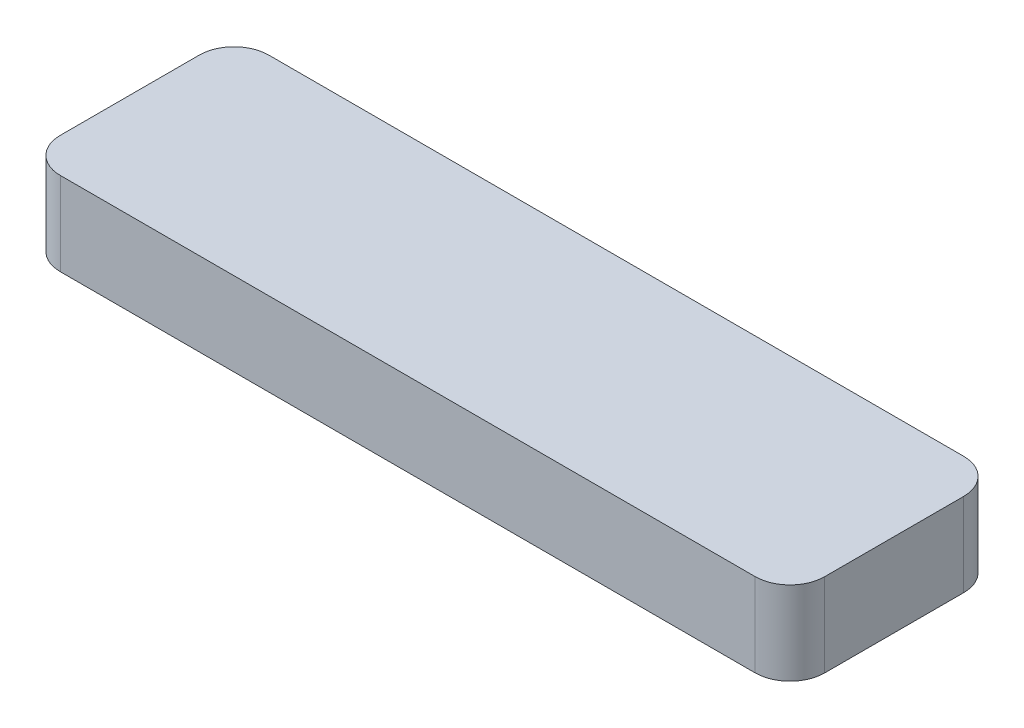
ISO-10303-21;
HEADER;
FILE_DESCRIPTION(('STEP AP214'),'2;1');
FILE_NAME('part.step','',(''),(''),'','','');
FILE_SCHEMA(('AUTOMOTIVE_DESIGN { 1 0 10303 214 1 1 1 1 }'));
ENDSEC;
DATA;
#1=APPLICATION_CONTEXT('core data for automotive mechanical design processes');
#2=APPLICATION_PROTOCOL_DEFINITION('international standard','automotive_design',2000,#1);
#3=PRODUCT_CONTEXT('',#1,'mechanical');
#4=PRODUCT('Part','Part','',(#3));
#5=PRODUCT_RELATED_PRODUCT_CATEGORY('part','',(#4));
#6=PRODUCT_DEFINITION_FORMATION('','',#4);
#7=PRODUCT_DEFINITION_CONTEXT('part definition',#1,'design');
#8=PRODUCT_DEFINITION('design','',#6,#7);
#9=PRODUCT_DEFINITION_SHAPE('','',#8);
#10=(LENGTH_UNIT() NAMED_UNIT(*) SI_UNIT(.MILLI.,.METRE.));
#11=(NAMED_UNIT(*) PLANE_ANGLE_UNIT() SI_UNIT($,.RADIAN.));
#12=(NAMED_UNIT(*) SI_UNIT($,.STERADIAN.) SOLID_ANGLE_UNIT());
#13=UNCERTAINTY_MEASURE_WITH_UNIT(LENGTH_MEASURE(1.E-05),#10,'distance_accuracy_value','');
#14=(GEOMETRIC_REPRESENTATION_CONTEXT(3) GLOBAL_UNCERTAINTY_ASSIGNED_CONTEXT((#13)) GLOBAL_UNIT_ASSIGNED_CONTEXT((#10,
#11,#12)) REPRESENTATION_CONTEXT('',''));
#15=CARTESIAN_POINT('',(0.,0.,0.));
#16=DIRECTION('',(0.,0.,1.));
#17=DIRECTION('',(1.,0.,0.));
#18=AXIS2_PLACEMENT_3D('',#15,#16,#17);
#19=CARTESIAN_POINT('',(40.1645862539652,-7.,-0.638374529553416));
#20=DIRECTION('',(1.,0.,0.));
#21=DIRECTION('',(0.,0.,-1.));
#22=AXIS2_PLACEMENT_3D('',#19,#20,#21);
#23=PLANE('',#22);
#24=DIRECTION('',(0.,1.,0.));
#25=VECTOR('',#24,1.);
#26=CARTESIAN_POINT('',(40.1645862539652,-9.,-7.10322873578327));
#27=LINE('',#26,#25);
#28=CARTESIAN_POINT('',(40.1645862539652,-4.,-7.10322873578327));
#29=VERTEX_POINT('',#28);
#30=CARTESIAN_POINT('',(40.1645862539652,-7.,-7.10322873578327));
#31=VERTEX_POINT('',#30);
#32=EDGE_CURVE('E209',#29,#31,#27,.F.);
#33=ORIENTED_EDGE('',*,*,#32,.F.);
#34=DIRECTION('',(0.,0.,-1.));
#35=VECTOR('',#34,1.);
#36=CARTESIAN_POINT('',(40.1645862539652,-4.,-0.638374529553416));
#37=LINE('',#36,#35);
#38=CARTESIAN_POINT('',(40.1645862539652,-4.,-7.43837452955341));
#39=VERTEX_POINT('',#38);
#40=EDGE_CURVE('E344',#29,#39,#37,.T.);
#41=ORIENTED_EDGE('',*,*,#40,.T.);
#42=DIRECTION('',(0.,1.,0.));
#43=VECTOR('',#42,1.);
#44=CARTESIAN_POINT('',(40.1645862539652,-7.,-7.43837452955341));
#45=LINE('',#44,#43);
#46=CARTESIAN_POINT('',(40.1645862539652,-7.,-7.43837452955341));
#47=VERTEX_POINT('',#46);
#48=EDGE_CURVE('E194',#47,#39,#45,.T.);
#49=ORIENTED_EDGE('',*,*,#48,.F.);
#50=DIRECTION('',(0.,0.,-1.));
#51=VECTOR('',#50,1.);
#52=CARTESIAN_POINT('',(40.1645862539652,-7.,-0.638374529553416));
#53=LINE('',#52,#51);
#54=EDGE_CURVE('E262',#31,#47,#53,.T.);
#55=ORIENTED_EDGE('',*,*,#54,.F.);
#56=EDGE_LOOP('',(#33,#41,#49,#55));
#57=FACE_BOUND('',#56,.T.);
#58=ADVANCED_FACE('F49',(#57),#23,.F.);
#59=DIRECTION('',(0.,1.,0.));
#60=VECTOR('',#59,1.);
#61=CARTESIAN_POINT('',(40.1645862539652,-7.,0.361625470446584));
#62=LINE('',#61,#60);
#63=CARTESIAN_POINT('',(40.1645862539652,-7.,0.361625470446584));
#64=VERTEX_POINT('',#63);
#65=CARTESIAN_POINT('',(40.1645862539652,-4.,0.361625470446584));
#66=VERTEX_POINT('',#65);
#67=EDGE_CURVE('E254',#64,#66,#62,.T.);
#68=ORIENTED_EDGE('',*,*,#67,.T.);
#69=DIRECTION('',(0.,0.,-1.));
#70=VECTOR('',#69,1.);
#71=CARTESIAN_POINT('',(40.1645862539652,-4.,-0.638374529553416));
#72=LINE('',#71,#70);
#73=CARTESIAN_POINT('',(40.1645862539652,-4.,0.0279345006787635));
#74=VERTEX_POINT('',#73);
#75=EDGE_CURVE('E295',#66,#74,#72,.T.);
#76=ORIENTED_EDGE('',*,*,#75,.T.);
#77=DIRECTION('',(0.,1.,0.));
#78=VECTOR('',#77,1.);
#79=CARTESIAN_POINT('',(40.1645862539652,-9.,0.0279345006787635));
#80=LINE('',#79,#78);
#81=CARTESIAN_POINT('',(40.1645862539652,-7.,0.0279345006787635));
#82=VERTEX_POINT('',#81);
#83=EDGE_CURVE('E213',#82,#74,#80,.T.);
#84=ORIENTED_EDGE('',*,*,#83,.F.);
#85=EDGE_CURVE('E265',#64,#82,#53,.T.);
#86=ORIENTED_EDGE('',*,*,#85,.F.);
#87=EDGE_LOOP('',(#68,#76,#84,#86));
#88=FACE_BOUND('',#87,.T.);
#89=ADVANCED_FACE('F293',(#88),#23,.F.);
#90=CARTESIAN_POINT('',(41.1645862539652,-7.,-7.43837452955341));
#91=DIRECTION('',(0.,0.,1.));
#92=DIRECTION('',(1.,0.,0.));
#93=AXIS2_PLACEMENT_3D('',#90,#91,#92);
#94=PLANE('',#93);
#95=DIRECTION('',(0.,1.,0.));
#96=VECTOR('',#95,1.);
#97=CARTESIAN_POINT('',(45.1536084731312,-9.,-7.43837452955341));
#98=LINE('',#97,#96);
#99=CARTESIAN_POINT('',(45.1536084731312,-4.,-7.43837452955341));
#100=VERTEX_POINT('',#99);
#101=CARTESIAN_POINT('',(45.1536084731312,-7.,-7.43837452955341));
#102=VERTEX_POINT('',#101);
#103=EDGE_CURVE('E304',#100,#102,#98,.F.);
#104=ORIENTED_EDGE('',*,*,#103,.F.);
#105=DIRECTION('',(1.,0.,0.));
#106=VECTOR('',#105,1.);
#107=CARTESIAN_POINT('',(41.1645862539652,-4.,-7.43837452955341));
#108=LINE('',#107,#106);
#109=CARTESIAN_POINT('',(45.5645862539652,-4.,-7.43837452955341));
#110=VERTEX_POINT('',#109);
#111=EDGE_CURVE('E65',#100,#110,#108,.T.);
#112=ORIENTED_EDGE('',*,*,#111,.T.);
#113=DIRECTION('',(0.,1.,0.));
#114=VECTOR('',#113,1.);
#115=CARTESIAN_POINT('',(45.5645862539652,-7.,-7.43837452955341));
#116=LINE('',#115,#114);
#117=CARTESIAN_POINT('',(45.5645862539652,-7.,-7.43837452955341));
#118=VERTEX_POINT('',#117);
#119=EDGE_CURVE('E253',#118,#110,#116,.T.);
#120=ORIENTED_EDGE('',*,*,#119,.F.);
#121=DIRECTION('',(1.,0.,0.));
#122=VECTOR('',#121,1.);
#123=CARTESIAN_POINT('',(41.1645862539652,-7.,-7.43837452955341));
#124=LINE('',#123,#122);
#125=EDGE_CURVE('E268',#102,#118,#124,.T.);
#126=ORIENTED_EDGE('',*,*,#125,.F.);
#127=EDGE_LOOP('',(#104,#112,#120,#126));
#128=FACE_BOUND('',#127,.T.);
#129=ADVANCED_FACE('F399',(#128),#94,.F.);
#130=ORIENTED_EDGE('',*,*,#48,.T.);
#131=DIRECTION('',(1.,0.,0.));
#132=VECTOR('',#131,1.);
#133=CARTESIAN_POINT('',(41.1645862539652,-4.,-7.43837452955341));
#134=LINE('',#133,#132);
#135=CARTESIAN_POINT('',(40.6661478739671,-4.,-7.43837452955341));
#136=VERTEX_POINT('',#135);
#137=EDGE_CURVE('E189',#39,#136,#134,.T.);
#138=ORIENTED_EDGE('',*,*,#137,.T.);
#139=DIRECTION('',(0.,1.,0.));
#140=VECTOR('',#139,1.);
#141=CARTESIAN_POINT('',(40.6661478739671,-9.,-7.43837452955341));
#142=LINE('',#141,#140);
#143=CARTESIAN_POINT('',(40.6661478739671,-7.,-7.43837452955341));
#144=VERTEX_POINT('',#143);
#145=EDGE_CURVE('E199',#144,#136,#142,.T.);
#146=ORIENTED_EDGE('',*,*,#145,.F.);
#147=EDGE_CURVE('E270',#47,#144,#124,.T.);
#148=ORIENTED_EDGE('',*,*,#147,.F.);
#149=EDGE_LOOP('',(#130,#138,#146,#148));
#150=FACE_BOUND('',#149,.T.);
#151=ADVANCED_FACE('F197',(#150),#94,.F.);
#152=CARTESIAN_POINT('',(45.5645862539652,-7.,-0.638374529553415));
#153=DIRECTION('',(-1.,0.,0.));
#154=DIRECTION('',(0.,0.,1.));
#155=AXIS2_PLACEMENT_3D('',#152,#153,#154);
#156=PLANE('',#155);
#157=DIRECTION('',(0.,1.,0.));
#158=VECTOR('',#157,1.);
#159=CARTESIAN_POINT('',(45.5645862539652,-9.,0.095880783506694));
#160=LINE('',#159,#158);
#161=CARTESIAN_POINT('',(45.5645862539652,-4.,0.095880783506694));
#162=VERTEX_POINT('',#161);
#163=CARTESIAN_POINT('',(45.5645862539652,-7.,0.095880783506694));
#164=VERTEX_POINT('',#163);
#165=EDGE_CURVE('E297',#162,#164,#160,.F.);
#166=ORIENTED_EDGE('',*,*,#165,.F.);
#167=DIRECTION('',(0.,0.,1.));
#168=VECTOR('',#167,1.);
#169=CARTESIAN_POINT('',(45.5645862539652,-4.,-0.638374529553415));
#170=LINE('',#169,#168);
#171=CARTESIAN_POINT('',(45.5645862539652,-4.,0.361625470446585));
#172=VERTEX_POINT('',#171);
#173=EDGE_CURVE('E336',#162,#172,#170,.T.);
#174=ORIENTED_EDGE('',*,*,#173,.T.);
#175=DIRECTION('',(0.,1.,0.));
#176=VECTOR('',#175,1.);
#177=CARTESIAN_POINT('',(45.5645862539652,-7.,0.361625470446585));
#178=LINE('',#177,#176);
#179=CARTESIAN_POINT('',(45.5645862539652,-7.,0.361625470446585));
#180=VERTEX_POINT('',#179);
#181=EDGE_CURVE('E257',#180,#172,#178,.T.);
#182=ORIENTED_EDGE('',*,*,#181,.F.);
#183=DIRECTION('',(0.,0.,1.));
#184=VECTOR('',#183,1.);
#185=CARTESIAN_POINT('',(45.5645862539652,-7.,-0.638374529553415));
#186=LINE('',#185,#184);
#187=EDGE_CURVE('E272',#164,#180,#186,.T.);
#188=ORIENTED_EDGE('',*,*,#187,.F.);
#189=EDGE_LOOP('',(#166,#174,#182,#188));
#190=FACE_BOUND('',#189,.T.);
#191=ADVANCED_FACE('F390',(#190),#156,.F.);
#192=ORIENTED_EDGE('',*,*,#119,.T.);
#193=DIRECTION('',(0.,0.,1.));
#194=VECTOR('',#193,1.);
#195=CARTESIAN_POINT('',(45.5645862539652,-4.,-0.638374529553415));
#196=LINE('',#195,#194);
#197=CARTESIAN_POINT('',(45.5645862539652,-4.,-7.1711750186112));
#198=VERTEX_POINT('',#197);
#199=EDGE_CURVE('E341',#110,#198,#196,.T.);
#200=ORIENTED_EDGE('',*,*,#199,.T.);
#201=DIRECTION('',(0.,1.,0.));
#202=VECTOR('',#201,1.);
#203=CARTESIAN_POINT('',(45.5645862539652,-9.,-7.1711750186112));
#204=LINE('',#203,#202);
#205=CARTESIAN_POINT('',(45.5645862539652,-7.,-7.1711750186112));
#206=VERTEX_POINT('',#205);
#207=EDGE_CURVE('E306',#206,#198,#204,.T.);
#208=ORIENTED_EDGE('',*,*,#207,.F.);
#209=EDGE_CURVE('E273',#118,#206,#186,.T.);
#210=ORIENTED_EDGE('',*,*,#209,.F.);
#211=EDGE_LOOP('',(#192,#200,#208,#210));
#212=FACE_BOUND('',#211,.T.);
#213=ADVANCED_FACE('F394',(#212),#156,.F.);
#214=CARTESIAN_POINT('',(41.1645862539652,-7.,0.361625470446584));
#215=DIRECTION('',(0.,0.,-1.));
#216=DIRECTION('',(-1.,0.,0.));
#217=AXIS2_PLACEMENT_3D('',#214,#215,#216);
#218=PLANE('',#217);
#219=DIRECTION('',(0.,1.,0.));
#220=VECTOR('',#219,1.);
#221=CARTESIAN_POINT('',(40.6636205559815,-9.,0.361625470446584));
#222=LINE('',#221,#220);
#223=CARTESIAN_POINT('',(40.6636205559815,-4.,0.361625470446584));
#224=VERTEX_POINT('',#223);
#225=CARTESIAN_POINT('',(40.6636205559815,-7.,0.361625470446584));
#226=VERTEX_POINT('',#225);
#227=EDGE_CURVE('E73',#224,#226,#222,.F.);
#228=ORIENTED_EDGE('',*,*,#227,.F.);
#229=DIRECTION('',(-1.,0.,0.));
#230=VECTOR('',#229,1.);
#231=CARTESIAN_POINT('',(41.1645862539652,-4.,0.361625470446584));
#232=LINE('',#231,#230);
#233=EDGE_CURVE('E290',#224,#66,#232,.T.);
#234=ORIENTED_EDGE('',*,*,#233,.T.);
#235=ORIENTED_EDGE('',*,*,#67,.F.);
#236=DIRECTION('',(-1.,0.,0.));
#237=VECTOR('',#236,1.);
#238=CARTESIAN_POINT('',(41.1645862539652,-7.,0.361625470446584));
#239=LINE('',#238,#237);
#240=EDGE_CURVE('E275',#226,#64,#239,.T.);
#241=ORIENTED_EDGE('',*,*,#240,.F.);
#242=EDGE_LOOP('',(#228,#234,#235,#241));
#243=FACE_BOUND('',#242,.T.);
#244=ADVANCED_FACE('F289',(#243),#218,.F.);
#245=ORIENTED_EDGE('',*,*,#181,.T.);
#246=DIRECTION('',(-1.,0.,0.));
#247=VECTOR('',#246,1.);
#248=CARTESIAN_POINT('',(41.1645862539652,-4.,0.361625470446584));
#249=LINE('',#248,#247);
#250=CARTESIAN_POINT('',(45.1561357911168,-4.,0.361625470446585));
#251=VERTEX_POINT('',#250);
#252=EDGE_CURVE('E333',#172,#251,#249,.T.);
#253=ORIENTED_EDGE('',*,*,#252,.T.);
#254=DIRECTION('',(0.,1.,0.));
#255=VECTOR('',#254,1.);
#256=CARTESIAN_POINT('',(45.1561357911168,-9.,0.361625470446585));
#257=LINE('',#256,#255);
#258=CARTESIAN_POINT('',(45.1561357911168,-7.,0.361625470446585));
#259=VERTEX_POINT('',#258);
#260=EDGE_CURVE('E301',#259,#251,#257,.T.);
#261=ORIENTED_EDGE('',*,*,#260,.F.);
#262=EDGE_CURVE('E258',#180,#259,#239,.T.);
#263=ORIENTED_EDGE('',*,*,#262,.F.);
#264=EDGE_LOOP('',(#245,#253,#261,#263));
#265=FACE_BOUND('',#264,.T.);
#266=ADVANCED_FACE('F385',(#265),#218,.F.);
#267=CARTESIAN_POINT('',(0.,-7.,0.));
#268=DIRECTION('',(0.,-1.,0.));
#269=DIRECTION('',(0.,0.,-1.));
#270=AXIS2_PLACEMENT_3D('',#267,#268,#269);
#271=PLANE('',#270);
#272=ORIENTED_EDGE('',*,*,#85,.T.);
#273=CARTESIAN_POINT('',(42.9098781735491,-7.,-3.53764711755225));
#274=DIRECTION('',(0.,-1.,0.));
#275=DIRECTION('',(0.,0.,-1.));
#276=AXIS2_PLACEMENT_3D('',#273,#274,#275);
#277=CIRCLE('',#276,4.5);
#278=EDGE_CURVE('E215',#82,#226,#277,.F.);
#279=ORIENTED_EDGE('',*,*,#278,.T.);
#280=ORIENTED_EDGE('',*,*,#240,.T.);
#281=EDGE_LOOP('',(#272,#279,#280));
#282=FACE_BOUND('',#281,.T.);
#283=ADVANCED_FACE('F285',(#282),#271,.T.);
#284=ORIENTED_EDGE('',*,*,#147,.T.);
#285=EDGE_CURVE('E208',#144,#31,#277,.F.);
#286=ORIENTED_EDGE('',*,*,#285,.T.);
#287=ORIENTED_EDGE('',*,*,#54,.T.);
#288=EDGE_LOOP('',(#284,#286,#287));
#289=FACE_BOUND('',#288,.T.);
#290=ADVANCED_FACE('F381',(#289),#271,.T.);
#291=DIRECTION('',(0.,0.,-1.));
#292=VECTOR('',#291,1.);
#293=CARTESIAN_POINT('',(41.1645862539652,-7.,-0.638374529553416));
#294=LINE('',#293,#292);
#295=CARTESIAN_POINT('',(41.1645862539652,-7.,-0.638374529553416));
#296=VERTEX_POINT('',#295);
#297=CARTESIAN_POINT('',(41.1645862539652,-7.,-6.43837452955341));
#298=VERTEX_POINT('',#297);
#299=EDGE_CURVE('E220',#296,#298,#294,.T.);
#300=ORIENTED_EDGE('',*,*,#299,.F.);
#301=DIRECTION('',(-1.,0.,0.));
#302=VECTOR('',#301,1.);
#303=CARTESIAN_POINT('',(41.1645862539652,-7.,-0.638374529553416));
#304=LINE('',#303,#302);
#305=CARTESIAN_POINT('',(44.5645862539652,-7.,-0.638374529553415));
#306=VERTEX_POINT('',#305);
#307=EDGE_CURVE('E228',#306,#296,#304,.T.);
#308=ORIENTED_EDGE('',*,*,#307,.F.);
#309=DIRECTION('',(0.,0.,1.));
#310=VECTOR('',#309,1.);
#311=CARTESIAN_POINT('',(44.5645862539652,-7.,-0.638374529553415));
#312=LINE('',#311,#310);
#313=CARTESIAN_POINT('',(44.5645862539652,-7.,-6.43837452955341));
#314=VERTEX_POINT('',#313);
#315=EDGE_CURVE('E225',#314,#306,#312,.T.);
#316=ORIENTED_EDGE('',*,*,#315,.F.);
#317=DIRECTION('',(1.,0.,0.));
#318=VECTOR('',#317,1.);
#319=CARTESIAN_POINT('',(41.1645862539652,-7.,-6.43837452955341));
#320=LINE('',#319,#318);
#321=EDGE_CURVE('E222',#298,#314,#320,.T.);
#322=ORIENTED_EDGE('',*,*,#321,.F.);
#323=EDGE_LOOP('',(#300,#308,#316,#322));
#324=FACE_BOUND('',#323,.T.);
#325=CARTESIAN_POINT('',(42.9098781735491,-7.,-3.53764711755225));
#326=DIRECTION('',(0.,-1.,0.));
#327=DIRECTION('',(0.,0.,-1.));
#328=AXIS2_PLACEMENT_3D('',#325,#326,#327);
#329=CIRCLE('',#328,3.7);
#330=CARTESIAN_POINT('',(40.1645862539652,-7.,-1.05704794068652));
#331=VERTEX_POINT('',#330);
#332=CARTESIAN_POINT('',(45.5645862539652,-7.,-0.960337472248865));
#333=VERTEX_POINT('',#332);
#334=EDGE_CURVE('E314',#331,#333,#329,.F.);
#335=ORIENTED_EDGE('',*,*,#334,.F.);
#336=CARTESIAN_POINT('',(40.1645862539652,-7.,-6.01824629441799));
#337=VERTEX_POINT('',#336);
#338=EDGE_CURVE('E269',#331,#337,#53,.T.);
#339=ORIENTED_EDGE('',*,*,#338,.T.);
#340=CARTESIAN_POINT('',(45.5645862539652,-7.,-6.11495676285564));
#341=VERTEX_POINT('',#340);
#342=EDGE_CURVE('E320',#341,#337,#329,.F.);
#343=ORIENTED_EDGE('',*,*,#342,.F.);
#344=EDGE_CURVE('E276',#341,#333,#186,.T.);
#345=ORIENTED_EDGE('',*,*,#344,.T.);
#346=EDGE_LOOP('',(#335,#339,#343,#345));
#347=FACE_BOUND('',#346,.T.);
#348=ADVANCED_FACE('F420',(#324,#347),#271,.T.);
#349=ORIENTED_EDGE('',*,*,#262,.T.);
#350=EDGE_CURVE('E298',#259,#164,#277,.F.);
#351=ORIENTED_EDGE('',*,*,#350,.T.);
#352=ORIENTED_EDGE('',*,*,#187,.T.);
#353=EDGE_LOOP('',(#349,#351,#352));
#354=FACE_BOUND('',#353,.T.);
#355=ADVANCED_FACE('F414',(#354),#271,.T.);
#356=DIRECTION('',(0.,0.,-1.));
#357=VECTOR('',#356,1.);
#358=CARTESIAN_POINT('',(40.1645862539652,0.,-0.638374529553416));
#359=LINE('',#358,#357);
#360=CARTESIAN_POINT('',(40.1645862539652,0.,-1.05704794068652));
#361=VERTEX_POINT('',#360);
#362=CARTESIAN_POINT('',(40.1645862539652,0.,-6.01824629441799));
#363=VERTEX_POINT('',#362);
#364=EDGE_CURVE('E249',#361,#363,#359,.T.);
#365=ORIENTED_EDGE('',*,*,#364,.T.);
#366=DIRECTION('',(0.,1.,0.));
#367=VECTOR('',#366,1.);
#368=CARTESIAN_POINT('',(40.1645862539652,-9.,-6.01824629441799));
#369=LINE('',#368,#367);
#370=EDGE_CURVE('E315',#363,#337,#369,.F.);
#371=ORIENTED_EDGE('',*,*,#370,.T.);
#372=ORIENTED_EDGE('',*,*,#338,.F.);
#373=DIRECTION('',(0.,1.,0.));
#374=VECTOR('',#373,1.);
#375=CARTESIAN_POINT('',(40.1645862539652,-9.,-1.05704794068652));
#376=LINE('',#375,#374);
#377=EDGE_CURVE('E309',#331,#361,#376,.T.);
#378=ORIENTED_EDGE('',*,*,#377,.T.);
#379=EDGE_LOOP('',(#365,#371,#372,#378));
#380=FACE_BOUND('',#379,.T.);
#381=ADVANCED_FACE('F377',(#380),#23,.F.);
#382=DIRECTION('',(0.,0.,1.));
#383=VECTOR('',#382,1.);
#384=CARTESIAN_POINT('',(45.5645862539652,0.,-0.638374529553415));
#385=LINE('',#384,#383);
#386=CARTESIAN_POINT('',(45.5645862539652,0.,-6.11495676285564));
#387=VERTEX_POINT('',#386);
#388=CARTESIAN_POINT('',(45.5645862539652,0.,-0.960337472248865));
#389=VERTEX_POINT('',#388);
#390=EDGE_CURVE('E251',#387,#389,#385,.T.);
#391=ORIENTED_EDGE('',*,*,#390,.T.);
#392=DIRECTION('',(0.,1.,0.));
#393=VECTOR('',#392,1.);
#394=CARTESIAN_POINT('',(45.5645862539652,-9.,-0.960337472248865));
#395=LINE('',#394,#393);
#396=EDGE_CURVE('E311',#389,#333,#395,.F.);
#397=ORIENTED_EDGE('',*,*,#396,.T.);
#398=ORIENTED_EDGE('',*,*,#344,.F.);
#399=DIRECTION('',(0.,1.,0.));
#400=VECTOR('',#399,1.);
#401=CARTESIAN_POINT('',(45.5645862539652,-9.,-6.11495676285564));
#402=LINE('',#401,#400);
#403=EDGE_CURVE('E318',#341,#387,#402,.T.);
#404=ORIENTED_EDGE('',*,*,#403,.T.);
#405=EDGE_LOOP('',(#391,#397,#398,#404));
#406=FACE_BOUND('',#405,.T.);
#407=ADVANCED_FACE('F413',(#406),#156,.F.);
#408=ORIENTED_EDGE('',*,*,#209,.T.);
#409=EDGE_CURVE('E216',#206,#102,#277,.F.);
#410=ORIENTED_EDGE('',*,*,#409,.T.);
#411=ORIENTED_EDGE('',*,*,#125,.T.);
#412=EDGE_LOOP('',(#408,#410,#411));
#413=FACE_BOUND('',#412,.T.);
#414=ADVANCED_FACE('F362',(#413),#271,.T.);
#415=CARTESIAN_POINT('',(0.,0.,0.));
#416=DIRECTION('',(0.,-1.,0.));
#417=DIRECTION('',(0.,0.,-1.));
#418=AXIS2_PLACEMENT_3D('',#415,#416,#417);
#419=PLANE('',#418);
#420=CARTESIAN_POINT('',(42.8645862539652,0.,-3.53837452955341));
#421=DIRECTION('',(0.,-1.,0.));
#422=DIRECTION('',(0.,0.,-1.));
#423=AXIS2_PLACEMENT_3D('',#420,#421,#422);
#424=CIRCLE('',#423,5.5);
#425=CARTESIAN_POINT('',(42.8645862539652,0.,-9.03837452955341));
#426=VERTEX_POINT('',#425);
#427=EDGE_CURVE('E347',#426,#426,#424,.T.);
#428=ORIENTED_EDGE('',*,*,#427,.F.);
#429=EDGE_LOOP('',(#428));
#430=FACE_BOUND('',#429,.T.);
#431=ORIENTED_EDGE('',*,*,#390,.F.);
#432=CARTESIAN_POINT('',(42.9098781735491,0.,-3.53764711755225));
#433=DIRECTION('',(0.,-1.,0.));
#434=DIRECTION('',(0.,0.,-1.));
#435=AXIS2_PLACEMENT_3D('',#432,#433,#434);
#436=CIRCLE('',#435,3.7);
#437=EDGE_CURVE('E327',#387,#389,#436,.T.);
#438=ORIENTED_EDGE('',*,*,#437,.T.);
#439=EDGE_LOOP('',(#431,#438));
#440=FACE_BOUND('',#439,.T.);
#441=ORIENTED_EDGE('',*,*,#364,.F.);
#442=EDGE_CURVE('E330',#361,#363,#436,.T.);
#443=ORIENTED_EDGE('',*,*,#442,.T.);
#444=EDGE_LOOP('',(#441,#443));
#445=FACE_BOUND('',#444,.T.);
#446=ADVANCED_FACE('F51',(#430,#440,#445),#419,.F.);
#447=CARTESIAN_POINT('',(41.1645862539652,-7.,-0.638374529553416));
#448=DIRECTION('',(1.,0.,0.));
#449=DIRECTION('',(0.,0.,-1.));
#450=AXIS2_PLACEMENT_3D('',#447,#448,#449);
#451=PLANE('',#450);
#452=DIRECTION('',(0.,0.,-1.));
#453=VECTOR('',#452,1.);
#454=CARTESIAN_POINT('',(41.1645862539652,-1.,-0.638374529553416));
#455=LINE('',#454,#453);
#456=CARTESIAN_POINT('',(41.1645862539652,-1.,-0.638374529553416));
#457=VERTEX_POINT('',#456);
#458=CARTESIAN_POINT('',(41.1645862539652,-1.,-6.43837452955341));
#459=VERTEX_POINT('',#458);
#460=EDGE_CURVE('E211',#457,#459,#455,.T.);
#461=ORIENTED_EDGE('',*,*,#460,.F.);
#462=DIRECTION('',(0.,1.,0.));
#463=VECTOR('',#462,1.);
#464=CARTESIAN_POINT('',(41.1645862539652,-7.,-0.638374529553416));
#465=LINE('',#464,#463);
#466=EDGE_CURVE('E230',#296,#457,#465,.T.);
#467=ORIENTED_EDGE('',*,*,#466,.F.);
#468=ORIENTED_EDGE('',*,*,#299,.T.);
#469=DIRECTION('',(0.,1.,0.));
#470=VECTOR('',#469,1.);
#471=CARTESIAN_POINT('',(41.1645862539652,-7.,-6.43837452955341));
#472=LINE('',#471,#470);
#473=EDGE_CURVE('E246',#298,#459,#472,.T.);
#474=ORIENTED_EDGE('',*,*,#473,.T.);
#475=EDGE_LOOP('',(#461,#467,#468,#474));
#476=FACE_BOUND('',#475,.T.);
#477=ADVANCED_FACE('F361',(#476),#451,.T.);
#478=CARTESIAN_POINT('',(41.1645862539652,-7.,-6.43837452955341));
#479=DIRECTION('',(0.,0.,1.));
#480=DIRECTION('',(1.,0.,0.));
#481=AXIS2_PLACEMENT_3D('',#478,#479,#480);
#482=PLANE('',#481);
#483=DIRECTION('',(1.,0.,0.));
#484=VECTOR('',#483,1.);
#485=CARTESIAN_POINT('',(41.1645862539652,-1.,-6.43837452955341));
#486=LINE('',#485,#484);
#487=CARTESIAN_POINT('',(44.5645862539652,-1.,-6.43837452955341));
#488=VERTEX_POINT('',#487);
#489=EDGE_CURVE('E233',#459,#488,#486,.T.);
#490=ORIENTED_EDGE('',*,*,#489,.F.);
#491=ORIENTED_EDGE('',*,*,#473,.F.);
#492=ORIENTED_EDGE('',*,*,#321,.T.);
#493=DIRECTION('',(0.,1.,0.));
#494=VECTOR('',#493,1.);
#495=CARTESIAN_POINT('',(44.5645862539652,-7.,-6.43837452955341));
#496=LINE('',#495,#494);
#497=EDGE_CURVE('E243',#314,#488,#496,.T.);
#498=ORIENTED_EDGE('',*,*,#497,.T.);
#499=EDGE_LOOP('',(#490,#491,#492,#498));
#500=FACE_BOUND('',#499,.T.);
#501=ADVANCED_FACE('F554',(#500),#482,.T.);
#502=CARTESIAN_POINT('',(44.5645862539652,-7.,-0.638374529553415));
#503=DIRECTION('',(-1.,0.,0.));
#504=DIRECTION('',(0.,0.,1.));
#505=AXIS2_PLACEMENT_3D('',#502,#503,#504);
#506=PLANE('',#505);
#507=DIRECTION('',(0.,0.,1.));
#508=VECTOR('',#507,1.);
#509=CARTESIAN_POINT('',(44.5645862539652,-1.,-0.638374529553415));
#510=LINE('',#509,#508);
#511=CARTESIAN_POINT('',(44.5645862539652,-1.,-0.638374529553415));
#512=VERTEX_POINT('',#511);
#513=EDGE_CURVE('E235',#488,#512,#510,.T.);
#514=ORIENTED_EDGE('',*,*,#513,.F.);
#515=ORIENTED_EDGE('',*,*,#497,.F.);
#516=ORIENTED_EDGE('',*,*,#315,.T.);
#517=DIRECTION('',(0.,1.,0.));
#518=VECTOR('',#517,1.);
#519=CARTESIAN_POINT('',(44.5645862539652,-7.,-0.638374529553415));
#520=LINE('',#519,#518);
#521=EDGE_CURVE('E240',#306,#512,#520,.T.);
#522=ORIENTED_EDGE('',*,*,#521,.T.);
#523=EDGE_LOOP('',(#514,#515,#516,#522));
#524=FACE_BOUND('',#523,.T.);
#525=ADVANCED_FACE('F544',(#524),#506,.T.);
#526=CARTESIAN_POINT('',(41.1645862539652,-7.,-0.638374529553416));
#527=DIRECTION('',(0.,0.,-1.));
#528=DIRECTION('',(-1.,0.,0.));
#529=AXIS2_PLACEMENT_3D('',#526,#527,#528);
#530=PLANE('',#529);
#531=DIRECTION('',(-1.,0.,0.));
#532=VECTOR('',#531,1.);
#533=CARTESIAN_POINT('',(41.1645862539652,-1.,-0.638374529553416));
#534=LINE('',#533,#532);
#535=EDGE_CURVE('E223',#512,#457,#534,.T.);
#536=ORIENTED_EDGE('',*,*,#535,.F.);
#537=ORIENTED_EDGE('',*,*,#521,.F.);
#538=ORIENTED_EDGE('',*,*,#307,.T.);
#539=ORIENTED_EDGE('',*,*,#466,.T.);
#540=EDGE_LOOP('',(#536,#537,#538,#539));
#541=FACE_BOUND('',#540,.T.);
#542=ADVANCED_FACE('F534',(#541),#530,.T.);
#543=CARTESIAN_POINT('',(0.,-1.,0.));
#544=DIRECTION('',(0.,-1.,0.));
#545=DIRECTION('',(0.,0.,-1.));
#546=AXIS2_PLACEMENT_3D('',#543,#544,#545);
#547=PLANE('',#546);
#548=ORIENTED_EDGE('',*,*,#460,.T.);
#549=ORIENTED_EDGE('',*,*,#489,.T.);
#550=ORIENTED_EDGE('',*,*,#513,.T.);
#551=ORIENTED_EDGE('',*,*,#535,.T.);
#552=EDGE_LOOP('',(#548,#549,#550,#551));
#553=FACE_BOUND('',#552,.T.);
#554=ADVANCED_FACE('F530',(#553),#547,.T.);
#555=CARTESIAN_POINT('',(42.9098781735491,-9.,-3.53764711755225));
#556=DIRECTION('',(0.,1.,0.));
#557=DIRECTION('',(0.,0.,1.));
#558=AXIS2_PLACEMENT_3D('',#555,#556,#557);
#559=CYLINDRICAL_SURFACE('',#558,4.5);
#560=CARTESIAN_POINT('',(42.9098781735491,-9.,-3.53764711755225));
#561=DIRECTION('',(0.,-1.,0.));
#562=DIRECTION('',(0.,0.,-1.));
#563=AXIS2_PLACEMENT_3D('',#560,#561,#562);
#564=CIRCLE('',#563,4.5);
#565=CARTESIAN_POINT('',(42.9098781735491,-9.,-8.03764711755225));
#566=VERTEX_POINT('',#565);
#567=EDGE_CURVE('E323',#566,#566,#564,.T.);
#568=ORIENTED_EDGE('',*,*,#567,.F.);
#569=EDGE_LOOP('',(#568));
#570=FACE_BOUND('',#569,.T.);
#571=ORIENTED_EDGE('',*,*,#207,.T.);
#572=CARTESIAN_POINT('',(42.9098781735491,-4.,-3.53764711755225));
#573=DIRECTION('',(0.,-1.,0.));
#574=DIRECTION('',(0.,0.,-1.));
#575=AXIS2_PLACEMENT_3D('',#572,#573,#574);
#576=CIRCLE('',#575,4.5);
#577=EDGE_CURVE('E12',#198,#162,#576,.T.);
#578=ORIENTED_EDGE('',*,*,#577,.T.);
#579=ORIENTED_EDGE('',*,*,#165,.T.);
#580=ORIENTED_EDGE('',*,*,#350,.F.);
#581=ORIENTED_EDGE('',*,*,#260,.T.);
#582=EDGE_CURVE('E58',#251,#224,#576,.T.);
#583=ORIENTED_EDGE('',*,*,#582,.T.);
#584=ORIENTED_EDGE('',*,*,#227,.T.);
#585=ORIENTED_EDGE('',*,*,#278,.F.);
#586=ORIENTED_EDGE('',*,*,#83,.T.);
#587=EDGE_CURVE('E193',#74,#29,#576,.T.);
#588=ORIENTED_EDGE('',*,*,#587,.T.);
#589=ORIENTED_EDGE('',*,*,#32,.T.);
#590=ORIENTED_EDGE('',*,*,#285,.F.);
#591=ORIENTED_EDGE('',*,*,#145,.T.);
#592=EDGE_CURVE('E53',#136,#100,#576,.T.);
#593=ORIENTED_EDGE('',*,*,#592,.T.);
#594=ORIENTED_EDGE('',*,*,#103,.T.);
#595=ORIENTED_EDGE('',*,*,#409,.F.);
#596=EDGE_LOOP('',(#571,#578,#579,#580,#581,#583,#584,#585,#586,#588,#589,#590,#591,#593,#594,#595));
#597=FACE_BOUND('',#596,.T.);
#598=ADVANCED_FACE('F206',(#570,#597),#559,.T.);
#599=CARTESIAN_POINT('',(42.9098781735491,-9.,-3.53764711755225));
#600=DIRECTION('',(0.,1.,0.));
#601=DIRECTION('',(0.,0.,1.));
#602=AXIS2_PLACEMENT_3D('',#599,#600,#601);
#603=CYLINDRICAL_SURFACE('',#602,3.7);
#604=CARTESIAN_POINT('',(42.9098781735491,-9.,-3.53764711755225));
#605=DIRECTION('',(0.,-1.,0.));
#606=DIRECTION('',(0.,0.,-1.));
#607=AXIS2_PLACEMENT_3D('',#604,#605,#606);
#608=CIRCLE('',#607,3.7);
#609=CARTESIAN_POINT('',(42.9098781735491,-9.,-7.23764711755225));
#610=VERTEX_POINT('',#609);
#611=EDGE_CURVE('E326',#610,#610,#608,.T.);
#612=ORIENTED_EDGE('',*,*,#611,.T.);
#613=EDGE_LOOP('',(#612));
#614=FACE_BOUND('',#613,.T.);
#615=ORIENTED_EDGE('',*,*,#377,.F.);
#616=ORIENTED_EDGE('',*,*,#334,.T.);
#617=ORIENTED_EDGE('',*,*,#396,.F.);
#618=ORIENTED_EDGE('',*,*,#437,.F.);
#619=ORIENTED_EDGE('',*,*,#403,.F.);
#620=ORIENTED_EDGE('',*,*,#342,.T.);
#621=ORIENTED_EDGE('',*,*,#370,.F.);
#622=ORIENTED_EDGE('',*,*,#442,.F.);
#623=EDGE_LOOP('',(#615,#616,#617,#618,#619,#620,#621,#622));
#624=FACE_BOUND('',#623,.T.);
#625=ADVANCED_FACE('F373',(#614,#624),#603,.F.);
#626=CARTESIAN_POINT('',(42.9098781735491,-9.,-3.53764711755225));
#627=DIRECTION('',(0.,-1.,0.));
#628=DIRECTION('',(0.,0.,-1.));
#629=AXIS2_PLACEMENT_3D('',#626,#627,#628);
#630=PLANE('',#629);
#631=ORIENTED_EDGE('',*,*,#567,.T.);
#632=EDGE_LOOP('',(#631));
#633=FACE_BOUND('',#632,.T.);
#634=ORIENTED_EDGE('',*,*,#611,.F.);
#635=EDGE_LOOP('',(#634));
#636=FACE_BOUND('',#635,.T.);
#637=ADVANCED_FACE('F469',(#633,#636),#630,.T.);
#638=CARTESIAN_POINT('',(42.8645862539652,-4.,-3.53837452955341));
#639=DIRECTION('',(0.,-1.,0.));
#640=DIRECTION('',(0.,0.,-1.));
#641=AXIS2_PLACEMENT_3D('',#638,#639,#640);
#642=PLANE('',#641);
#643=ORIENTED_EDGE('',*,*,#252,.F.);
#644=ORIENTED_EDGE('',*,*,#173,.F.);
#645=ORIENTED_EDGE('',*,*,#577,.F.);
#646=ORIENTED_EDGE('',*,*,#199,.F.);
#647=ORIENTED_EDGE('',*,*,#111,.F.);
#648=ORIENTED_EDGE('',*,*,#592,.F.);
#649=ORIENTED_EDGE('',*,*,#137,.F.);
#650=ORIENTED_EDGE('',*,*,#40,.F.);
#651=ORIENTED_EDGE('',*,*,#587,.F.);
#652=ORIENTED_EDGE('',*,*,#75,.F.);
#653=ORIENTED_EDGE('',*,*,#233,.F.);
#654=ORIENTED_EDGE('',*,*,#582,.F.);
#655=EDGE_LOOP('',(#643,#644,#645,#646,#647,#648,#649,#650,#651,#652,#653,#654));
#656=FACE_BOUND('',#655,.T.);
#657=CARTESIAN_POINT('',(42.8645862539652,-4.,-3.53837452955341));
#658=DIRECTION('',(0.,-1.,0.));
#659=DIRECTION('',(0.,0.,-1.));
#660=AXIS2_PLACEMENT_3D('',#657,#658,#659);
#661=CIRCLE('',#660,5.5);
#662=CARTESIAN_POINT('',(42.8645862539652,-4.,-9.03837452955341));
#663=VERTEX_POINT('',#662);
#664=EDGE_CURVE('E202',#663,#663,#661,.T.);
#665=ORIENTED_EDGE('',*,*,#664,.T.);
#666=EDGE_LOOP('',(#665));
#667=FACE_BOUND('',#666,.T.);
#668=ADVANCED_FACE('F187',(#656,#667),#642,.T.);
#669=CARTESIAN_POINT('',(42.8645862539652,-4.,-3.53837452955341));
#670=DIRECTION('',(0.,1.,0.));
#671=DIRECTION('',(0.,0.,1.));
#672=AXIS2_PLACEMENT_3D('',#669,#670,#671);
#673=CYLINDRICAL_SURFACE('',#672,5.5);
#674=ORIENTED_EDGE('',*,*,#664,.F.);
#675=EDGE_LOOP('',(#674));
#676=FACE_BOUND('',#675,.T.);
#677=ORIENTED_EDGE('',*,*,#427,.T.);
#678=EDGE_LOOP('',(#677));
#679=FACE_BOUND('',#678,.T.);
#680=ADVANCED_FACE('F353',(#676,#679),#673,.T.);
#681=CLOSED_SHELL('',(#58,#89,#129,#151,#191,#213,#244,#266,#283,#290,#348,#355,#381,#407,#414,
#446,#477,#501,#525,#542,#554,#598,#625,#637,#668,#680));
#682=MANIFOLD_SOLID_BREP('B2',#681);
#683=CARTESIAN_POINT('',(-49.6145692439427,12.,-18.5383745295534));
#684=DIRECTION('',(1.,0.,0.));
#685=DIRECTION('',(0.,0.,-1.));
#686=AXIS2_PLACEMENT_3D('',#683,#684,#685);
#687=PLANE('',#686);
#688=DIRECTION('',(0.,0.,1.));
#689=VECTOR('',#688,1.);
#690=CARTESIAN_POINT('',(-49.6145692439427,12.,-18.5383745295534));
#691=LINE('',#690,#689);
#692=CARTESIAN_POINT('',(-49.6145692439427,12.,-13.5383745295534));
#693=VERTEX_POINT('',#692);
#694=CARTESIAN_POINT('',(-49.6145692439427,12.,6.46162547044658));
#695=VERTEX_POINT('',#694);
#696=EDGE_CURVE('E720',#693,#695,#691,.T.);
#697=ORIENTED_EDGE('',*,*,#696,.F.);
#698=DIRECTION('',(0.,-1.,0.));
#699=VECTOR('',#698,1.);
#700=CARTESIAN_POINT('',(-49.6145692439427,12.,-13.5383745295534));
#701=LINE('',#700,#699);
#702=CARTESIAN_POINT('',(-49.6145692439427,0.,-13.5383745295534));
#703=VERTEX_POINT('',#702);
#704=EDGE_CURVE('E704',#693,#703,#701,.T.);
#705=ORIENTED_EDGE('',*,*,#704,.T.);
#706=DIRECTION('',(0.,0.,1.));
#707=VECTOR('',#706,1.);
#708=CARTESIAN_POINT('',(-49.6145692439427,0.,-18.5383745295534));
#709=LINE('',#708,#707);
#710=CARTESIAN_POINT('',(-49.6145692439427,0.,6.46162547044658));
#711=VERTEX_POINT('',#710);
#712=EDGE_CURVE('E717',#703,#711,#709,.T.);
#713=ORIENTED_EDGE('',*,*,#712,.T.);
#714=DIRECTION('',(0.,-1.,0.));
#715=VECTOR('',#714,1.);
#716=CARTESIAN_POINT('',(-49.6145692439427,12.,6.46162547044658));
#717=LINE('',#716,#715);
#718=EDGE_CURVE('E723',#711,#695,#717,.F.);
#719=ORIENTED_EDGE('',*,*,#718,.T.);
#720=EDGE_LOOP('',(#697,#705,#713,#719));
#721=FACE_BOUND('',#720,.T.);
#722=ADVANCED_FACE('F634',(#721),#687,.F.);
#723=CARTESIAN_POINT('',(-49.6145692439427,12.,11.4616254704466));
#724=DIRECTION('',(0.,0.,-1.));
#725=DIRECTION('',(-1.,0.,0.));
#726=AXIS2_PLACEMENT_3D('',#723,#724,#725);
#727=PLANE('',#726);
#728=DIRECTION('',(1.,0.,0.));
#729=VECTOR('',#728,1.);
#730=CARTESIAN_POINT('',(-49.6145692439427,12.,11.4616254704466));
#731=LINE('',#730,#729);
#732=CARTESIAN_POINT('',(-44.6145692439427,12.,11.4616254704466));
#733=VERTEX_POINT('',#732);
#734=CARTESIAN_POINT('',(55.3854307560573,12.,11.4616254704466));
#735=VERTEX_POINT('',#734);
#736=EDGE_CURVE('E791',#733,#735,#731,.T.);
#737=ORIENTED_EDGE('',*,*,#736,.F.);
#738=DIRECTION('',(0.,-1.,0.));
#739=VECTOR('',#738,1.);
#740=CARTESIAN_POINT('',(-44.6145692439427,12.,11.4616254704466));
#741=LINE('',#740,#739);
#742=CARTESIAN_POINT('',(-44.6145692439427,0.,11.4616254704466));
#743=VERTEX_POINT('',#742);
#744=EDGE_CURVE('E771',#733,#743,#741,.T.);
#745=ORIENTED_EDGE('',*,*,#744,.T.);
#746=DIRECTION('',(1.,0.,0.));
#747=VECTOR('',#746,1.);
#748=CARTESIAN_POINT('',(-49.6145692439427,0.,11.4616254704466));
#749=LINE('',#748,#747);
#750=CARTESIAN_POINT('',(55.3854307560573,0.,11.4616254704466));
#751=VERTEX_POINT('',#750);
#752=EDGE_CURVE('E728',#743,#751,#749,.T.);
#753=ORIENTED_EDGE('',*,*,#752,.T.);
#754=DIRECTION('',(0.,-1.,0.));
#755=VECTOR('',#754,1.);
#756=CARTESIAN_POINT('',(55.3854307560573,12.,11.4616254704466));
#757=LINE('',#756,#755);
#758=EDGE_CURVE('E768',#751,#735,#757,.F.);
#759=ORIENTED_EDGE('',*,*,#758,.T.);
#760=EDGE_LOOP('',(#737,#745,#753,#759));
#761=FACE_BOUND('',#760,.T.);
#762=ADVANCED_FACE('F803',(#761),#727,.F.);
#763=CARTESIAN_POINT('',(60.3854307560573,12.,-18.5383745295534));
#764=DIRECTION('',(-1.,0.,0.));
#765=DIRECTION('',(0.,0.,1.));
#766=AXIS2_PLACEMENT_3D('',#763,#764,#765);
#767=PLANE('',#766);
#768=DIRECTION('',(0.,0.,-1.));
#769=VECTOR('',#768,1.);
#770=CARTESIAN_POINT('',(60.3854307560573,0.,-18.5383745295534));
#771=LINE('',#770,#769);
#772=CARTESIAN_POINT('',(60.3854307560573,0.,6.46162547044658));
#773=VERTEX_POINT('',#772);
#774=CARTESIAN_POINT('',(60.3854307560573,0.,-13.5383745295534));
#775=VERTEX_POINT('',#774);
#776=EDGE_CURVE('E732',#773,#775,#771,.T.);
#777=ORIENTED_EDGE('',*,*,#776,.T.);
#778=DIRECTION('',(0.,-1.,0.));
#779=VECTOR('',#778,1.);
#780=CARTESIAN_POINT('',(60.3854307560573,12.,-13.5383745295534));
#781=LINE('',#780,#779);
#782=CARTESIAN_POINT('',(60.3854307560573,12.,-13.5383745295534));
#783=VERTEX_POINT('',#782);
#784=EDGE_CURVE('E47',#775,#783,#781,.F.);
#785=ORIENTED_EDGE('',*,*,#784,.T.);
#786=DIRECTION('',(0.,0.,-1.));
#787=VECTOR('',#786,1.);
#788=CARTESIAN_POINT('',(60.3854307560573,12.,-18.5383745295534));
#789=LINE('',#788,#787);
#790=CARTESIAN_POINT('',(60.3854307560573,12.,6.46162547044658));
#791=VERTEX_POINT('',#790);
#792=EDGE_CURVE('E779',#791,#783,#789,.T.);
#793=ORIENTED_EDGE('',*,*,#792,.F.);
#794=DIRECTION('',(0.,-1.,0.));
#795=VECTOR('',#794,1.);
#796=CARTESIAN_POINT('',(60.3854307560573,12.,6.46162547044658));
#797=LINE('',#796,#795);
#798=EDGE_CURVE('E643',#791,#773,#797,.T.);
#799=ORIENTED_EDGE('',*,*,#798,.T.);
#800=EDGE_LOOP('',(#777,#785,#793,#799));
#801=FACE_BOUND('',#800,.T.);
#802=ADVANCED_FACE('F778',(#801),#767,.F.);
#803=CARTESIAN_POINT('',(-49.6145692439427,12.,-18.5383745295534));
#804=DIRECTION('',(0.,0.,1.));
#805=DIRECTION('',(1.,0.,0.));
#806=AXIS2_PLACEMENT_3D('',#803,#804,#805);
#807=PLANE('',#806);
#808=DIRECTION('',(-1.,0.,0.));
#809=VECTOR('',#808,1.);
#810=CARTESIAN_POINT('',(-49.6145692439427,0.,-18.5383745295534));
#811=LINE('',#810,#809);
#812=CARTESIAN_POINT('',(55.3854307560573,0.,-18.5383745295534));
#813=VERTEX_POINT('',#812);
#814=CARTESIAN_POINT('',(-44.6145692439427,0.,-18.5383745295534));
#815=VERTEX_POINT('',#814);
#816=EDGE_CURVE('E740',#813,#815,#811,.T.);
#817=ORIENTED_EDGE('',*,*,#816,.T.);
#818=DIRECTION('',(0.,-1.,0.));
#819=VECTOR('',#818,1.);
#820=CARTESIAN_POINT('',(-44.6145692439427,12.,-18.5383745295534));
#821=LINE('',#820,#819);
#822=CARTESIAN_POINT('',(-44.6145692439427,12.,-18.5383745295534));
#823=VERTEX_POINT('',#822);
#824=EDGE_CURVE('E705',#815,#823,#821,.F.);
#825=ORIENTED_EDGE('',*,*,#824,.T.);
#826=DIRECTION('',(-1.,0.,0.));
#827=VECTOR('',#826,1.);
#828=CARTESIAN_POINT('',(-49.6145692439427,12.,-18.5383745295534));
#829=LINE('',#828,#827);
#830=CARTESIAN_POINT('',(55.3854307560573,12.,-18.5383745295534));
#831=VERTEX_POINT('',#830);
#832=EDGE_CURVE('E735',#831,#823,#829,.T.);
#833=ORIENTED_EDGE('',*,*,#832,.F.);
#834=DIRECTION('',(0.,-1.,0.));
#835=VECTOR('',#834,1.);
#836=CARTESIAN_POINT('',(55.3854307560573,12.,-18.5383745295534));
#837=LINE('',#836,#835);
#838=EDGE_CURVE('E711',#831,#813,#837,.T.);
#839=ORIENTED_EDGE('',*,*,#838,.T.);
#840=EDGE_LOOP('',(#817,#825,#833,#839));
#841=FACE_BOUND('',#840,.T.);
#842=ADVANCED_FACE('F787',(#841),#807,.F.);
#843=CARTESIAN_POINT('',(0.,12.,0.));
#844=DIRECTION('',(0.,1.,0.));
#845=DIRECTION('',(0.,0.,1.));
#846=AXIS2_PLACEMENT_3D('',#843,#844,#845);
#847=PLANE('',#846);
#848=ORIENTED_EDGE('',*,*,#832,.T.);
#849=CARTESIAN_POINT('',(-44.6145692439427,12.,-13.5383745295534));
#850=DIRECTION('',(0.,1.,0.));
#851=DIRECTION('',(0.,0.,1.));
#852=AXIS2_PLACEMENT_3D('',#849,#850,#851);
#853=CIRCLE('',#852,5.);
#854=EDGE_CURVE('E765',#823,#693,#853,.T.);
#855=ORIENTED_EDGE('',*,*,#854,.T.);
#856=ORIENTED_EDGE('',*,*,#696,.T.);
#857=CARTESIAN_POINT('',(-44.6145692439427,12.,6.46162547044658));
#858=DIRECTION('',(0.,1.,0.));
#859=DIRECTION('',(0.,0.,1.));
#860=AXIS2_PLACEMENT_3D('',#857,#858,#859);
#861=CIRCLE('',#860,5.);
#862=EDGE_CURVE('E762',#695,#733,#861,.T.);
#863=ORIENTED_EDGE('',*,*,#862,.T.);
#864=ORIENTED_EDGE('',*,*,#736,.T.);
#865=CARTESIAN_POINT('',(55.3854307560573,12.,6.46162547044658));
#866=DIRECTION('',(0.,1.,0.));
#867=DIRECTION('',(0.,0.,1.));
#868=AXIS2_PLACEMENT_3D('',#865,#866,#867);
#869=CIRCLE('',#868,5.);
#870=EDGE_CURVE('E655',#735,#791,#869,.T.);
#871=ORIENTED_EDGE('',*,*,#870,.T.);
#872=ORIENTED_EDGE('',*,*,#792,.T.);
#873=CARTESIAN_POINT('',(55.3854307560573,12.,-13.5383745295534));
#874=DIRECTION('',(0.,1.,0.));
#875=DIRECTION('',(0.,0.,1.));
#876=AXIS2_PLACEMENT_3D('',#873,#874,#875);
#877=CIRCLE('',#876,5.);
#878=EDGE_CURVE('E759',#783,#831,#877,.T.);
#879=ORIENTED_EDGE('',*,*,#878,.T.);
#880=EDGE_LOOP('',(#848,#855,#856,#863,#864,#871,#872,#879));
#881=FACE_BOUND('',#880,.T.);
#882=ADVANCED_FACE('F797',(#881),#847,.T.);
#883=CARTESIAN_POINT('',(0.,0.,0.));
#884=DIRECTION('',(0.,1.,0.));
#885=DIRECTION('',(0.,0.,1.));
#886=AXIS2_PLACEMENT_3D('',#883,#884,#885);
#887=PLANE('',#886);
#888=ORIENTED_EDGE('',*,*,#712,.F.);
#889=CARTESIAN_POINT('',(-44.6145692439427,0.,-13.5383745295534));
#890=DIRECTION('',(0.,1.,0.));
#891=DIRECTION('',(0.,0.,1.));
#892=AXIS2_PLACEMENT_3D('',#889,#890,#891);
#893=CIRCLE('',#892,5.);
#894=EDGE_CURVE('E700',#703,#815,#893,.F.);
#895=ORIENTED_EDGE('',*,*,#894,.T.);
#896=ORIENTED_EDGE('',*,*,#816,.F.);
#897=CARTESIAN_POINT('',(55.3854307560573,0.,-13.5383745295534));
#898=DIRECTION('',(0.,1.,0.));
#899=DIRECTION('',(0.,0.,1.));
#900=AXIS2_PLACEMENT_3D('',#897,#898,#899);
#901=CIRCLE('',#900,5.);
#902=EDGE_CURVE('E747',#813,#775,#901,.F.);
#903=ORIENTED_EDGE('',*,*,#902,.T.);
#904=ORIENTED_EDGE('',*,*,#776,.F.);
#905=CARTESIAN_POINT('',(55.3854307560573,0.,6.46162547044658));
#906=DIRECTION('',(0.,1.,0.));
#907=DIRECTION('',(0.,0.,1.));
#908=AXIS2_PLACEMENT_3D('',#905,#906,#907);
#909=CIRCLE('',#908,5.);
#910=EDGE_CURVE('E722',#773,#751,#909,.F.);
#911=ORIENTED_EDGE('',*,*,#910,.T.);
#912=ORIENTED_EDGE('',*,*,#752,.F.);
#913=CARTESIAN_POINT('',(-44.6145692439427,0.,6.46162547044658));
#914=DIRECTION('',(0.,1.,0.));
#915=DIRECTION('',(0.,0.,1.));
#916=AXIS2_PLACEMENT_3D('',#913,#914,#915);
#917=CIRCLE('',#916,5.);
#918=EDGE_CURVE('E712',#743,#711,#917,.F.);
#919=ORIENTED_EDGE('',*,*,#918,.T.);
#920=EDGE_LOOP('',(#888,#895,#896,#903,#904,#911,#912,#919));
#921=FACE_BOUND('',#920,.T.);
#922=ADVANCED_FACE('F725',(#921),#887,.F.);
#923=CARTESIAN_POINT('',(-44.6145692439427,12.,-13.5383745295534));
#924=DIRECTION('',(0.,-1.,0.));
#925=DIRECTION('',(0.,0.,-1.));
#926=AXIS2_PLACEMENT_3D('',#923,#924,#925);
#927=CYLINDRICAL_SURFACE('',#926,5.);
#928=ORIENTED_EDGE('',*,*,#854,.F.);
#929=ORIENTED_EDGE('',*,*,#824,.F.);
#930=ORIENTED_EDGE('',*,*,#894,.F.);
#931=ORIENTED_EDGE('',*,*,#704,.F.);
#932=EDGE_LOOP('',(#928,#929,#930,#931));
#933=FACE_BOUND('',#932,.T.);
#934=ADVANCED_FACE('F703',(#933),#927,.T.);
#935=CARTESIAN_POINT('',(-44.6145692439427,12.,6.46162547044658));
#936=DIRECTION('',(0.,-1.,0.));
#937=DIRECTION('',(0.,0.,-1.));
#938=AXIS2_PLACEMENT_3D('',#935,#936,#937);
#939=CYLINDRICAL_SURFACE('',#938,5.);
#940=ORIENTED_EDGE('',*,*,#862,.F.);
#941=ORIENTED_EDGE('',*,*,#718,.F.);
#942=ORIENTED_EDGE('',*,*,#918,.F.);
#943=ORIENTED_EDGE('',*,*,#744,.F.);
#944=EDGE_LOOP('',(#940,#941,#942,#943));
#945=FACE_BOUND('',#944,.T.);
#946=ADVANCED_FACE('F801',(#945),#939,.T.);
#947=CARTESIAN_POINT('',(55.3854307560573,12.,-13.5383745295534));
#948=DIRECTION('',(0.,-1.,0.));
#949=DIRECTION('',(0.,0.,-1.));
#950=AXIS2_PLACEMENT_3D('',#947,#948,#949);
#951=CYLINDRICAL_SURFACE('',#950,5.);
#952=ORIENTED_EDGE('',*,*,#878,.F.);
#953=ORIENTED_EDGE('',*,*,#784,.F.);
#954=ORIENTED_EDGE('',*,*,#902,.F.);
#955=ORIENTED_EDGE('',*,*,#838,.F.);
#956=EDGE_LOOP('',(#952,#953,#954,#955));
#957=FACE_BOUND('',#956,.T.);
#958=ADVANCED_FACE('F784',(#957),#951,.T.);
#959=CARTESIAN_POINT('',(55.3854307560573,12.,6.46162547044658));
#960=DIRECTION('',(0.,-1.,0.));
#961=DIRECTION('',(0.,0.,-1.));
#962=AXIS2_PLACEMENT_3D('',#959,#960,#961);
#963=CYLINDRICAL_SURFACE('',#962,5.);
#964=ORIENTED_EDGE('',*,*,#870,.F.);
#965=ORIENTED_EDGE('',*,*,#758,.F.);
#966=ORIENTED_EDGE('',*,*,#910,.F.);
#967=ORIENTED_EDGE('',*,*,#798,.F.);
#968=EDGE_LOOP('',(#964,#965,#966,#967));
#969=FACE_BOUND('',#968,.T.);
#970=ADVANCED_FACE('F636',(#969),#963,.T.);
#971=CLOSED_SHELL('',(#722,#762,#802,#842,#882,#922,#934,#946,#958,#970));
#972=MANIFOLD_SOLID_BREP('B6',#971);
#973=ADVANCED_BREP_SHAPE_REPRESENTATION('',(#18,#682,#972),#14);
#974=SHAPE_DEFINITION_REPRESENTATION(#9,#973);
ENDSEC;
END-ISO-10303-21;
